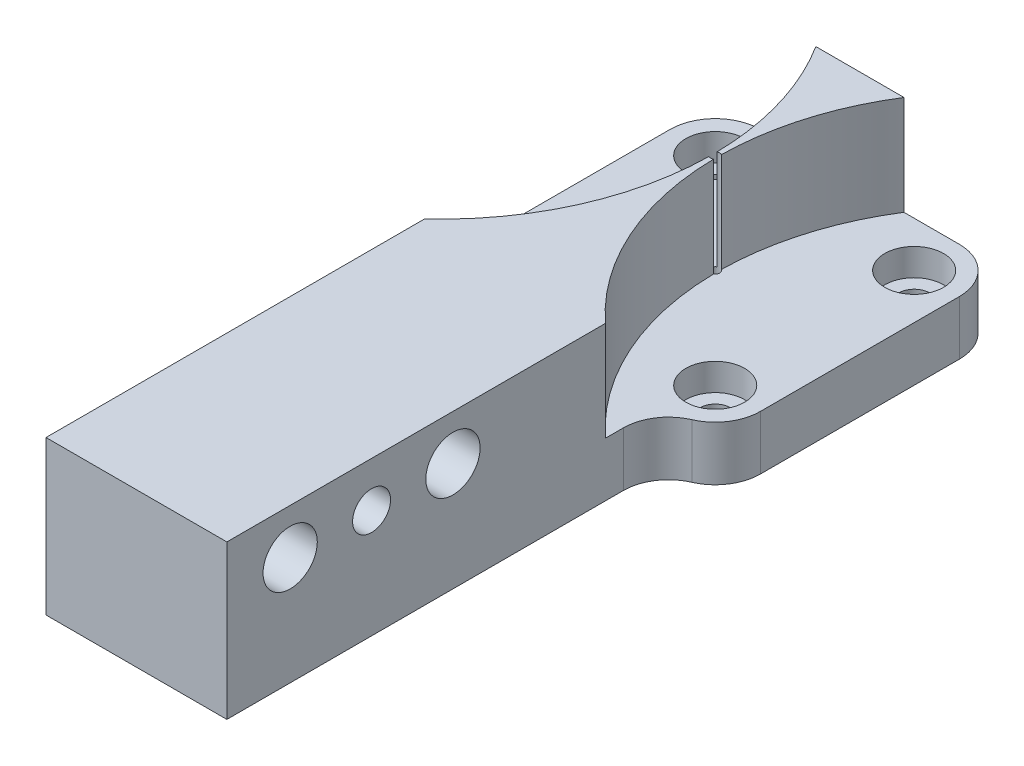
ISO-10303-21;
HEADER;
FILE_DESCRIPTION(('STEP AP214'),'2;1');
FILE_NAME('part.step','',(''),(''),'','','');
FILE_SCHEMA(('AUTOMOTIVE_DESIGN { 1 0 10303 214 1 1 1 1 }'));
ENDSEC;
DATA;
#1=APPLICATION_CONTEXT('core data for automotive mechanical design processes');
#2=APPLICATION_PROTOCOL_DEFINITION('international standard','automotive_design',2000,#1);
#3=PRODUCT_CONTEXT('',#1,'mechanical');
#4=PRODUCT('Part','Part','',(#3));
#5=PRODUCT_RELATED_PRODUCT_CATEGORY('part','',(#4));
#6=PRODUCT_DEFINITION_FORMATION('','',#4);
#7=PRODUCT_DEFINITION_CONTEXT('part definition',#1,'design');
#8=PRODUCT_DEFINITION('design','',#6,#7);
#9=PRODUCT_DEFINITION_SHAPE('','',#8);
#10=(LENGTH_UNIT() NAMED_UNIT(*) SI_UNIT(.MILLI.,.METRE.));
#11=(NAMED_UNIT(*) PLANE_ANGLE_UNIT() SI_UNIT($,.RADIAN.));
#12=(NAMED_UNIT(*) SI_UNIT($,.STERADIAN.) SOLID_ANGLE_UNIT());
#13=UNCERTAINTY_MEASURE_WITH_UNIT(LENGTH_MEASURE(1.E-05),#10,'distance_accuracy_value','');
#14=(GEOMETRIC_REPRESENTATION_CONTEXT(3) GLOBAL_UNCERTAINTY_ASSIGNED_CONTEXT((#13)) GLOBAL_UNIT_ASSIGNED_CONTEXT((#10,
#11,#12)) REPRESENTATION_CONTEXT('',''));
#15=CARTESIAN_POINT('',(0.,0.,0.));
#16=DIRECTION('',(0.,0.,1.));
#17=DIRECTION('',(1.,0.,0.));
#18=AXIS2_PLACEMENT_3D('',#15,#16,#17);
#19=CARTESIAN_POINT('',(30.25,11.,16.25));
#20=DIRECTION('',(0.,-1.,0.));
#21=DIRECTION('',(0.,0.,-1.));
#22=AXIS2_PLACEMENT_3D('',#19,#20,#21);
#23=CYLINDRICAL_SURFACE('',#22,30.);
#24=DIRECTION('',(0.,-1.,0.));
#25=VECTOR('',#24,1.);
#26=CARTESIAN_POINT('',(4.87284491910096,11.,0.25));
#27=LINE('',#26,#25);
#28=CARTESIAN_POINT('',(4.87284491910096,11.,0.249999999999999));
#29=VERTEX_POINT('',#28);
#30=CARTESIAN_POINT('',(4.87284491910096,0.,0.25));
#31=VERTEX_POINT('',#30);
#32=EDGE_CURVE('E290',#29,#31,#27,.T.);
#33=ORIENTED_EDGE('',*,*,#32,.F.);
#34=CARTESIAN_POINT('',(30.25,11.,16.25));
#35=DIRECTION('',(0.,-1.,0.));
#36=DIRECTION('',(0.,0.,1.));
#37=AXIS2_PLACEMENT_3D('',#34,#35,#36);
#38=CIRCLE('',#37,30.);
#39=CARTESIAN_POINT('',(0.253099173553696,11.,15.8187914560837));
#40=VERTEX_POINT('',#39);
#41=EDGE_CURVE('E415',#40,#29,#38,.T.);
#42=ORIENTED_EDGE('',*,*,#41,.F.);
#43=DIRECTION('',(0.,1.,0.));
#44=VECTOR('',#43,1.);
#45=CARTESIAN_POINT('',(0.253099173553695,2.5,15.8187914560837));
#46=LINE('',#45,#44);
#47=CARTESIAN_POINT('',(0.25309917355372,0.,15.8187914560836));
#48=VERTEX_POINT('',#47);
#49=EDGE_CURVE('E342',#40,#48,#46,.F.);
#50=ORIENTED_EDGE('',*,*,#49,.T.);
#51=CARTESIAN_POINT('',(30.25,0.,16.25));
#52=DIRECTION('',(0.,-1.,0.));
#53=DIRECTION('',(0.,0.,1.));
#54=AXIS2_PLACEMENT_3D('',#51,#52,#53);
#55=CIRCLE('',#54,30.);
#56=EDGE_CURVE('E410',#48,#31,#55,.T.);
#57=ORIENTED_EDGE('',*,*,#56,.T.);
#58=EDGE_LOOP('',(#33,#42,#50,#57));
#59=FACE_BOUND('',#58,.T.);
#60=ADVANCED_FACE('F55',(#59),#23,.F.);
#61=CARTESIAN_POINT('',(-30.25,11.,16.25));
#62=DIRECTION('',(0.,-1.,0.));
#63=DIRECTION('',(0.,0.,-1.));
#64=AXIS2_PLACEMENT_3D('',#61,#62,#63);
#65=CYLINDRICAL_SURFACE('',#64,30.);
#66=DIRECTION('',(0.,-1.,0.));
#67=VECTOR('',#66,1.);
#68=CARTESIAN_POINT('',(-10.,11.,38.3845318450606));
#69=LINE('',#68,#67);
#70=CARTESIAN_POINT('',(-10.,11.,38.3845318450606));
#71=VERTEX_POINT('',#70);
#72=CARTESIAN_POINT('',(-10.,0.,38.3845318450606));
#73=VERTEX_POINT('',#72);
#74=EDGE_CURVE('E279',#71,#73,#69,.T.);
#75=ORIENTED_EDGE('',*,*,#74,.F.);
#76=CARTESIAN_POINT('',(-30.25,11.,16.25));
#77=DIRECTION('',(0.,-1.,0.));
#78=DIRECTION('',(0.,0.,1.));
#79=AXIS2_PLACEMENT_3D('',#76,#77,#78);
#80=CIRCLE('',#79,30.);
#81=CARTESIAN_POINT('',(-0.25309917355372,11.,16.6812085439164));
#82=VERTEX_POINT('',#81);
#83=EDGE_CURVE('E414',#82,#71,#80,.T.);
#84=ORIENTED_EDGE('',*,*,#83,.F.);
#85=DIRECTION('',(0.,1.,0.));
#86=VECTOR('',#85,1.);
#87=CARTESIAN_POINT('',(-0.253099173553695,2.5,16.6812085439163));
#88=LINE('',#87,#86);
#89=CARTESIAN_POINT('',(-0.25309917355372,0.,16.6812085439164));
#90=VERTEX_POINT('',#89);
#91=EDGE_CURVE('E64',#82,#90,#88,.F.);
#92=ORIENTED_EDGE('',*,*,#91,.T.);
#93=CARTESIAN_POINT('',(-30.25,0.,16.25));
#94=DIRECTION('',(0.,-1.,0.));
#95=DIRECTION('',(0.,0.,1.));
#96=AXIS2_PLACEMENT_3D('',#93,#94,#95);
#97=CIRCLE('',#96,30.);
#98=EDGE_CURVE('E419',#90,#73,#97,.T.);
#99=ORIENTED_EDGE('',*,*,#98,.T.);
#100=EDGE_LOOP('',(#75,#84,#92,#99));
#101=FACE_BOUND('',#100,.T.);
#102=ADVANCED_FACE('F498',(#101),#65,.F.);
#103=CARTESIAN_POINT('',(30.25,11.,16.25));
#104=DIRECTION('',(0.,1.,0.));
#105=DIRECTION('',(0.,0.,1.));
#106=AXIS2_PLACEMENT_3D('',#103,#104,#105);
#107=PLANE('',#106);
#108=ORIENTED_EDGE('',*,*,#41,.T.);
#109=DIRECTION('',(-1.,0.,0.));
#110=VECTOR('',#109,1.);
#111=CARTESIAN_POINT('',(-11.,11.,0.249999999999999));
#112=LINE('',#111,#110);
#113=CARTESIAN_POINT('',(-4.87284491910096,11.,0.249999999999999));
#114=VERTEX_POINT('',#113);
#115=EDGE_CURVE('E515',#29,#114,#112,.T.);
#116=ORIENTED_EDGE('',*,*,#115,.T.);
#117=CARTESIAN_POINT('',(-0.253099173553696,11.,15.8187914560837));
#118=VERTEX_POINT('',#117);
#119=EDGE_CURVE('E228',#114,#118,#80,.T.);
#120=ORIENTED_EDGE('',*,*,#119,.T.);
#121=CARTESIAN_POINT('',(0.,11.,16.25));
#122=DIRECTION('',(0.,1.,0.));
#123=DIRECTION('',(0.,0.,1.));
#124=AXIS2_PLACEMENT_3D('',#121,#122,#123);
#125=CIRCLE('',#124,0.499999999999998);
#126=EDGE_CURVE('E226',#40,#118,#125,.T.);
#127=ORIENTED_EDGE('',*,*,#126,.F.);
#128=EDGE_LOOP('',(#108,#116,#120,#127));
#129=FACE_BOUND('',#128,.T.);
#130=ADVANCED_FACE('F513',(#129),#107,.T.);
#131=CARTESIAN_POINT('',(0.,0.,0.));
#132=DIRECTION('',(0.,1.,0.));
#133=DIRECTION('',(0.,0.,1.));
#134=AXIS2_PLACEMENT_3D('',#131,#132,#133);
#135=PLANE('',#134);
#136=CARTESIAN_POINT('',(11.,0.,5.25));
#137=DIRECTION('',(0.,1.,0.));
#138=DIRECTION('',(0.,0.,1.));
#139=AXIS2_PLACEMENT_3D('',#136,#137,#138);
#140=CIRCLE('',#139,3.25);
#141=CARTESIAN_POINT('',(11.,0.,8.5));
#142=VERTEX_POINT('',#141);
#143=EDGE_CURVE('E362',#142,#142,#140,.T.);
#144=ORIENTED_EDGE('',*,*,#143,.F.);
#145=EDGE_LOOP('',(#144));
#146=FACE_BOUND('',#145,.T.);
#147=CARTESIAN_POINT('',(11.,0.,27.25));
#148=DIRECTION('',(0.,1.,0.));
#149=DIRECTION('',(0.,0.,1.));
#150=AXIS2_PLACEMENT_3D('',#147,#148,#149);
#151=CIRCLE('',#150,3.25);
#152=CARTESIAN_POINT('',(11.,0.,30.5));
#153=VERTEX_POINT('',#152);
#154=EDGE_CURVE('E378',#153,#153,#151,.T.);
#155=ORIENTED_EDGE('',*,*,#154,.F.);
#156=EDGE_LOOP('',(#155));
#157=FACE_BOUND('',#156,.T.);
#158=CARTESIAN_POINT('',(11.,0.,5.25));
#159=DIRECTION('',(0.,1.,0.));
#160=DIRECTION('',(0.,0.,1.));
#161=AXIS2_PLACEMENT_3D('',#158,#159,#160);
#162=CIRCLE('',#161,5.);
#163=CARTESIAN_POINT('',(16.,0.,5.25));
#164=VERTEX_POINT('',#163);
#165=CARTESIAN_POINT('',(11.,0.,0.249999999999999));
#166=VERTEX_POINT('',#165);
#167=EDGE_CURVE('E304',#164,#166,#162,.T.);
#168=ORIENTED_EDGE('',*,*,#167,.T.);
#169=DIRECTION('',(-1.,0.,0.));
#170=VECTOR('',#169,1.);
#171=CARTESIAN_POINT('',(0.,0.,0.249999999999999));
#172=LINE('',#171,#170);
#173=EDGE_CURVE('E286',#166,#31,#172,.T.);
#174=ORIENTED_EDGE('',*,*,#173,.T.);
#175=ORIENTED_EDGE('',*,*,#56,.F.);
#176=CARTESIAN_POINT('',(0.,0.,16.25));
#177=DIRECTION('',(0.,1.,0.));
#178=DIRECTION('',(0.,0.,1.));
#179=AXIS2_PLACEMENT_3D('',#176,#177,#178);
#180=CIRCLE('',#179,0.499999999999997);
#181=CARTESIAN_POINT('',(0.25309917355372,0.,16.6812085439163));
#182=VERTEX_POINT('',#181);
#183=EDGE_CURVE('E339',#182,#48,#180,.T.);
#184=ORIENTED_EDGE('',*,*,#183,.F.);
#185=CARTESIAN_POINT('',(9.99999999999999,0.,38.3845318450606));
#186=VERTEX_POINT('',#185);
#187=EDGE_CURVE('E417',#186,#182,#55,.T.);
#188=ORIENTED_EDGE('',*,*,#187,.F.);
#189=DIRECTION('',(0.,0.,-1.));
#190=VECTOR('',#189,1.);
#191=CARTESIAN_POINT('',(9.99999999999999,0.,0.));
#192=LINE('',#191,#190);
#193=CARTESIAN_POINT('',(9.99999999999999,0.,36.4151513899117));
#194=VERTEX_POINT('',#193);
#195=EDGE_CURVE('E254',#186,#194,#192,.T.);
#196=ORIENTED_EDGE('',*,*,#195,.T.);
#197=CARTESIAN_POINT('',(15.,0.,36.4151513899117));
#198=DIRECTION('',(0.,1.,0.));
#199=DIRECTION('',(0.,0.,1.));
#200=AXIS2_PLACEMENT_3D('',#197,#198,#199);
#201=CIRCLE('',#200,5.);
#202=CARTESIAN_POINT('',(13.,0.,31.8325756949558));
#203=VERTEX_POINT('',#202);
#204=EDGE_CURVE('E293',#194,#203,#201,.F.);
#205=ORIENTED_EDGE('',*,*,#204,.T.);
#206=CARTESIAN_POINT('',(11.,0.,27.25));
#207=DIRECTION('',(0.,1.,0.));
#208=DIRECTION('',(0.,0.,1.));
#209=AXIS2_PLACEMENT_3D('',#206,#207,#208);
#210=CIRCLE('',#209,5.);
#211=CARTESIAN_POINT('',(16.,0.,27.25));
#212=VERTEX_POINT('',#211);
#213=EDGE_CURVE('E296',#203,#212,#210,.T.);
#214=ORIENTED_EDGE('',*,*,#213,.T.);
#215=DIRECTION('',(0.,0.,-1.));
#216=VECTOR('',#215,1.);
#217=CARTESIAN_POINT('',(16.,0.,0.));
#218=LINE('',#217,#216);
#219=EDGE_CURVE('E300',#212,#164,#218,.T.);
#220=ORIENTED_EDGE('',*,*,#219,.T.);
#221=EDGE_LOOP('',(#168,#174,#175,#184,#188,#196,#205,#214,#220));
#222=FACE_BOUND('',#221,.T.);
#223=ADVANCED_FACE('F432',(#146,#157,#222),#135,.T.);
#224=CARTESIAN_POINT('',(-11.,0.,5.25));
#225=DIRECTION('',(0.,1.,0.));
#226=DIRECTION('',(0.,0.,1.));
#227=AXIS2_PLACEMENT_3D('',#224,#225,#226);
#228=CIRCLE('',#227,3.25);
#229=CARTESIAN_POINT('',(-11.,0.,8.5));
#230=VERTEX_POINT('',#229);
#231=EDGE_CURVE('E346',#230,#230,#228,.T.);
#232=ORIENTED_EDGE('',*,*,#231,.F.);
#233=EDGE_LOOP('',(#232));
#234=FACE_BOUND('',#233,.T.);
#235=CARTESIAN_POINT('',(-11.,0.,27.25));
#236=DIRECTION('',(0.,1.,0.));
#237=DIRECTION('',(0.,0.,1.));
#238=AXIS2_PLACEMENT_3D('',#235,#236,#237);
#239=CIRCLE('',#238,3.25);
#240=CARTESIAN_POINT('',(-11.,0.,30.5));
#241=VERTEX_POINT('',#240);
#242=EDGE_CURVE('E394',#241,#241,#239,.T.);
#243=ORIENTED_EDGE('',*,*,#242,.F.);
#244=EDGE_LOOP('',(#243));
#245=FACE_BOUND('',#244,.T.);
#246=CARTESIAN_POINT('',(-15.,0.,36.4151513899117));
#247=DIRECTION('',(0.,1.,0.));
#248=DIRECTION('',(0.,0.,1.));
#249=AXIS2_PLACEMENT_3D('',#246,#247,#248);
#250=CIRCLE('',#249,5.);
#251=CARTESIAN_POINT('',(-13.,0.,31.8325756949558));
#252=VERTEX_POINT('',#251);
#253=CARTESIAN_POINT('',(-10.,0.,36.4151513899117));
#254=VERTEX_POINT('',#253);
#255=EDGE_CURVE('E320',#252,#254,#250,.F.);
#256=ORIENTED_EDGE('',*,*,#255,.T.);
#257=DIRECTION('',(0.,0.,1.));
#258=VECTOR('',#257,1.);
#259=CARTESIAN_POINT('',(-10.,0.,0.));
#260=LINE('',#259,#258);
#261=EDGE_CURVE('E275',#254,#73,#260,.T.);
#262=ORIENTED_EDGE('',*,*,#261,.T.);
#263=ORIENTED_EDGE('',*,*,#98,.F.);
#264=CARTESIAN_POINT('',(0.,0.,16.25));
#265=DIRECTION('',(0.,1.,0.));
#266=DIRECTION('',(0.,0.,1.));
#267=AXIS2_PLACEMENT_3D('',#264,#265,#266);
#268=CIRCLE('',#267,0.499999999999997);
#269=CARTESIAN_POINT('',(-0.25309917355372,0.,15.8187914560837));
#270=VERTEX_POINT('',#269);
#271=EDGE_CURVE('E244',#270,#90,#268,.T.);
#272=ORIENTED_EDGE('',*,*,#271,.F.);
#273=CARTESIAN_POINT('',(-4.87284491910096,0.,0.25));
#274=VERTEX_POINT('',#273);
#275=EDGE_CURVE('E232',#274,#270,#97,.T.);
#276=ORIENTED_EDGE('',*,*,#275,.F.);
#277=DIRECTION('',(-1.,0.,0.));
#278=VECTOR('',#277,1.);
#279=CARTESIAN_POINT('',(0.,0.,0.249999999999999));
#280=LINE('',#279,#278);
#281=CARTESIAN_POINT('',(-11.,0.,0.249999999999999));
#282=VERTEX_POINT('',#281);
#283=EDGE_CURVE('E282',#274,#282,#280,.T.);
#284=ORIENTED_EDGE('',*,*,#283,.T.);
#285=CARTESIAN_POINT('',(-11.,0.,5.25));
#286=DIRECTION('',(0.,1.,0.));
#287=DIRECTION('',(0.,0.,1.));
#288=AXIS2_PLACEMENT_3D('',#285,#286,#287);
#289=CIRCLE('',#288,5.);
#290=CARTESIAN_POINT('',(-16.,0.,5.25));
#291=VERTEX_POINT('',#290);
#292=EDGE_CURVE('E308',#282,#291,#289,.T.);
#293=ORIENTED_EDGE('',*,*,#292,.T.);
#294=DIRECTION('',(0.,0.,1.));
#295=VECTOR('',#294,1.);
#296=CARTESIAN_POINT('',(-16.,0.,0.));
#297=LINE('',#296,#295);
#298=CARTESIAN_POINT('',(-16.,0.,27.25));
#299=VERTEX_POINT('',#298);
#300=EDGE_CURVE('E312',#291,#299,#297,.T.);
#301=ORIENTED_EDGE('',*,*,#300,.T.);
#302=CARTESIAN_POINT('',(-11.,0.,27.25));
#303=DIRECTION('',(0.,1.,0.));
#304=DIRECTION('',(0.,0.,1.));
#305=AXIS2_PLACEMENT_3D('',#302,#303,#304);
#306=CIRCLE('',#305,5.);
#307=EDGE_CURVE('E316',#299,#252,#306,.T.);
#308=ORIENTED_EDGE('',*,*,#307,.T.);
#309=EDGE_LOOP('',(#256,#262,#263,#272,#276,#284,#293,#301,#308));
#310=FACE_BOUND('',#309,.T.);
#311=ADVANCED_FACE('F496',(#234,#245,#310),#135,.T.);
#312=CARTESIAN_POINT('',(-16.25,-6.,80.25));
#313=DIRECTION('',(0.,0.,1.));
#314=DIRECTION('',(1.,0.,0.));
#315=AXIS2_PLACEMENT_3D('',#312,#313,#314);
#316=PLANE('',#315);
#317=DIRECTION('',(1.,0.,0.));
#318=VECTOR('',#317,1.);
#319=CARTESIAN_POINT('',(-16.25,11.,80.25));
#320=LINE('',#319,#318);
#321=CARTESIAN_POINT('',(-10.,11.,80.25));
#322=VERTEX_POINT('',#321);
#323=CARTESIAN_POINT('',(9.99999999999999,11.,80.25));
#324=VERTEX_POINT('',#323);
#325=EDGE_CURVE('E222',#322,#324,#320,.T.);
#326=ORIENTED_EDGE('',*,*,#325,.F.);
#327=DIRECTION('',(0.,1.,0.));
#328=VECTOR('',#327,1.);
#329=CARTESIAN_POINT('',(-10.,-6.,80.25));
#330=LINE('',#329,#328);
#331=CARTESIAN_POINT('',(-10.,-6.,80.25));
#332=VERTEX_POINT('',#331);
#333=EDGE_CURVE('E219',#332,#322,#330,.T.);
#334=ORIENTED_EDGE('',*,*,#333,.F.);
#335=DIRECTION('',(1.,0.,0.));
#336=VECTOR('',#335,1.);
#337=CARTESIAN_POINT('',(-16.25,-6.,80.25));
#338=LINE('',#337,#336);
#339=CARTESIAN_POINT('',(9.99999999999999,-6.,80.25));
#340=VERTEX_POINT('',#339);
#341=EDGE_CURVE('E211',#332,#340,#338,.T.);
#342=ORIENTED_EDGE('',*,*,#341,.T.);
#343=DIRECTION('',(0.,1.,0.));
#344=VECTOR('',#343,1.);
#345=CARTESIAN_POINT('',(9.99999999999999,-6.,80.25));
#346=LINE('',#345,#344);
#347=EDGE_CURVE('E191',#340,#324,#346,.T.);
#348=ORIENTED_EDGE('',*,*,#347,.T.);
#349=EDGE_LOOP('',(#326,#334,#342,#348));
#350=FACE_BOUND('',#349,.T.);
#351=ADVANCED_FACE('F57',(#350),#316,.T.);
#352=CARTESIAN_POINT('',(0.,-6.,0.));
#353=DIRECTION('',(0.,1.,0.));
#354=DIRECTION('',(0.,0.,1.));
#355=AXIS2_PLACEMENT_3D('',#352,#353,#354);
#356=PLANE('',#355);
#357=CARTESIAN_POINT('',(-11.,-6.,27.25));
#358=DIRECTION('',(0.,1.,0.));
#359=DIRECTION('',(0.,0.,1.));
#360=AXIS2_PLACEMENT_3D('',#357,#358,#359);
#361=CIRCLE('',#360,1.7);
#362=CARTESIAN_POINT('',(-11.,-6.,28.95));
#363=VERTEX_POINT('',#362);
#364=EDGE_CURVE('E406',#363,#363,#361,.T.);
#365=ORIENTED_EDGE('',*,*,#364,.T.);
#366=EDGE_LOOP('',(#365));
#367=FACE_BOUND('',#366,.T.);
#368=CARTESIAN_POINT('',(11.,-6.,27.25));
#369=DIRECTION('',(0.,1.,0.));
#370=DIRECTION('',(0.,0.,1.));
#371=AXIS2_PLACEMENT_3D('',#368,#369,#370);
#372=CIRCLE('',#371,1.7);
#373=CARTESIAN_POINT('',(11.,-6.,28.95));
#374=VERTEX_POINT('',#373);
#375=EDGE_CURVE('E390',#374,#374,#372,.T.);
#376=ORIENTED_EDGE('',*,*,#375,.T.);
#377=EDGE_LOOP('',(#376));
#378=FACE_BOUND('',#377,.T.);
#379=CARTESIAN_POINT('',(11.,-6.,5.25));
#380=DIRECTION('',(0.,1.,0.));
#381=DIRECTION('',(0.,0.,1.));
#382=AXIS2_PLACEMENT_3D('',#379,#380,#381);
#383=CIRCLE('',#382,1.7);
#384=CARTESIAN_POINT('',(11.,-6.,6.94999999999999));
#385=VERTEX_POINT('',#384);
#386=EDGE_CURVE('E374',#385,#385,#383,.T.);
#387=ORIENTED_EDGE('',*,*,#386,.T.);
#388=EDGE_LOOP('',(#387));
#389=FACE_BOUND('',#388,.T.);
#390=CARTESIAN_POINT('',(-11.,-6.,5.25));
#391=DIRECTION('',(0.,1.,0.));
#392=DIRECTION('',(0.,0.,1.));
#393=AXIS2_PLACEMENT_3D('',#390,#391,#392);
#394=CIRCLE('',#393,1.7);
#395=CARTESIAN_POINT('',(-11.,-6.,6.95));
#396=VERTEX_POINT('',#395);
#397=EDGE_CURVE('E358',#396,#396,#394,.T.);
#398=ORIENTED_EDGE('',*,*,#397,.T.);
#399=EDGE_LOOP('',(#398));
#400=FACE_BOUND('',#399,.T.);
#401=CARTESIAN_POINT('',(0.,-6.,16.25));
#402=DIRECTION('',(0.,-1.,0.));
#403=DIRECTION('',(0.,0.,-1.));
#404=AXIS2_PLACEMENT_3D('',#401,#402,#403);
#405=CIRCLE('',#404,1.5);
#406=CARTESIAN_POINT('',(0.,-6.,14.75));
#407=VERTEX_POINT('',#406);
#408=EDGE_CURVE('E324',#407,#407,#405,.T.);
#409=ORIENTED_EDGE('',*,*,#408,.F.);
#410=EDGE_LOOP('',(#409));
#411=FACE_BOUND('',#410,.T.);
#412=DIRECTION('',(0.,0.,1.));
#413=VECTOR('',#412,1.);
#414=CARTESIAN_POINT('',(-10.,-6.,80.25));
#415=LINE('',#414,#413);
#416=CARTESIAN_POINT('',(-10.,-6.,36.4151513899117));
#417=VERTEX_POINT('',#416);
#418=EDGE_CURVE('E205',#417,#332,#415,.T.);
#419=ORIENTED_EDGE('',*,*,#418,.F.);
#420=CARTESIAN_POINT('',(-15.,-6.,36.4151513899117));
#421=DIRECTION('',(0.,-1.,0.));
#422=DIRECTION('',(0.,0.,1.));
#423=AXIS2_PLACEMENT_3D('',#420,#421,#422);
#424=CIRCLE('',#423,5.);
#425=CARTESIAN_POINT('',(-13.,-6.,31.8325756949558));
#426=VERTEX_POINT('',#425);
#427=EDGE_CURVE('E561',#426,#417,#424,.T.);
#428=ORIENTED_EDGE('',*,*,#427,.F.);
#429=CARTESIAN_POINT('',(-11.,-6.,27.25));
#430=DIRECTION('',(0.,1.,0.));
#431=DIRECTION('',(0.,0.,1.));
#432=AXIS2_PLACEMENT_3D('',#429,#430,#431);
#433=CIRCLE('',#432,5.);
#434=CARTESIAN_POINT('',(-16.,-6.,27.25));
#435=VERTEX_POINT('',#434);
#436=EDGE_CURVE('E554',#435,#426,#433,.T.);
#437=ORIENTED_EDGE('',*,*,#436,.F.);
#438=DIRECTION('',(0.,0.,1.));
#439=VECTOR('',#438,1.);
#440=CARTESIAN_POINT('',(-16.,-6.,5.25));
#441=LINE('',#440,#439);
#442=CARTESIAN_POINT('',(-16.,-6.,5.25));
#443=VERTEX_POINT('',#442);
#444=EDGE_CURVE('E550',#443,#435,#441,.T.);
#445=ORIENTED_EDGE('',*,*,#444,.F.);
#446=CARTESIAN_POINT('',(-11.,-6.,5.25));
#447=DIRECTION('',(0.,1.,0.));
#448=DIRECTION('',(0.,0.,1.));
#449=AXIS2_PLACEMENT_3D('',#446,#447,#448);
#450=CIRCLE('',#449,5.);
#451=CARTESIAN_POINT('',(-11.,-6.,0.249999999999999));
#452=VERTEX_POINT('',#451);
#453=EDGE_CURVE('E542',#452,#443,#450,.T.);
#454=ORIENTED_EDGE('',*,*,#453,.F.);
#455=DIRECTION('',(-1.,0.,0.));
#456=VECTOR('',#455,1.);
#457=CARTESIAN_POINT('',(-11.,-6.,0.249999999999999));
#458=LINE('',#457,#456);
#459=CARTESIAN_POINT('',(11.,-6.,0.249999999999999));
#460=VERTEX_POINT('',#459);
#461=EDGE_CURVE('E546',#460,#452,#458,.T.);
#462=ORIENTED_EDGE('',*,*,#461,.F.);
#463=CARTESIAN_POINT('',(11.,-6.,5.25));
#464=DIRECTION('',(0.,1.,0.));
#465=DIRECTION('',(0.,0.,1.));
#466=AXIS2_PLACEMENT_3D('',#463,#464,#465);
#467=CIRCLE('',#466,5.);
#468=CARTESIAN_POINT('',(16.,-6.,5.25));
#469=VERTEX_POINT('',#468);
#470=EDGE_CURVE('E443',#469,#460,#467,.T.);
#471=ORIENTED_EDGE('',*,*,#470,.F.);
#472=DIRECTION('',(0.,0.,-1.));
#473=VECTOR('',#472,1.);
#474=CARTESIAN_POINT('',(16.,-6.,5.25));
#475=LINE('',#474,#473);
#476=CARTESIAN_POINT('',(16.,-6.,27.25));
#477=VERTEX_POINT('',#476);
#478=EDGE_CURVE('E883',#477,#469,#475,.T.);
#479=ORIENTED_EDGE('',*,*,#478,.F.);
#480=CARTESIAN_POINT('',(11.,-6.,27.25));
#481=DIRECTION('',(0.,1.,0.));
#482=DIRECTION('',(0.,0.,1.));
#483=AXIS2_PLACEMENT_3D('',#480,#481,#482);
#484=CIRCLE('',#483,5.);
#485=CARTESIAN_POINT('',(13.,-6.,31.8325756949558));
#486=VERTEX_POINT('',#485);
#487=EDGE_CURVE('E878',#486,#477,#484,.T.);
#488=ORIENTED_EDGE('',*,*,#487,.F.);
#489=CARTESIAN_POINT('',(15.,-6.,36.4151513899117));
#490=DIRECTION('',(0.,-1.,0.));
#491=DIRECTION('',(0.,0.,1.));
#492=AXIS2_PLACEMENT_3D('',#489,#490,#491);
#493=CIRCLE('',#492,5.);
#494=CARTESIAN_POINT('',(9.99999999999999,-6.,36.4151513899117));
#495=VERTEX_POINT('',#494);
#496=EDGE_CURVE('E214',#495,#486,#493,.T.);
#497=ORIENTED_EDGE('',*,*,#496,.F.);
#498=DIRECTION('',(0.,0.,-1.));
#499=VECTOR('',#498,1.);
#500=CARTESIAN_POINT('',(9.99999999999999,-6.,80.25));
#501=LINE('',#500,#499);
#502=EDGE_CURVE('E196',#340,#495,#501,.T.);
#503=ORIENTED_EDGE('',*,*,#502,.F.);
#504=ORIENTED_EDGE('',*,*,#341,.F.);
#505=EDGE_LOOP('',(#419,#428,#437,#445,#454,#462,#471,#479,#488,#497,#503,#504));
#506=FACE_BOUND('',#505,.T.);
#507=ADVANCED_FACE('F210',(#367,#378,#389,#400,#411,#506),#356,.F.);
#508=DIRECTION('',(0.,-1.,0.));
#509=VECTOR('',#508,1.);
#510=CARTESIAN_POINT('',(9.99999999999999,11.,38.3845318450606));
#511=LINE('',#510,#509);
#512=CARTESIAN_POINT('',(9.99999999999999,11.,38.3845318450606));
#513=VERTEX_POINT('',#512);
#514=EDGE_CURVE('E71',#186,#513,#511,.F.);
#515=ORIENTED_EDGE('',*,*,#514,.F.);
#516=ORIENTED_EDGE('',*,*,#187,.T.);
#517=DIRECTION('',(0.,1.,0.));
#518=VECTOR('',#517,1.);
#519=CARTESIAN_POINT('',(0.253099173553695,2.5,16.6812085439163));
#520=LINE('',#519,#518);
#521=CARTESIAN_POINT('',(0.253099173553696,11.,16.6812085439163));
#522=VERTEX_POINT('',#521);
#523=EDGE_CURVE('E335',#182,#522,#520,.T.);
#524=ORIENTED_EDGE('',*,*,#523,.T.);
#525=EDGE_CURVE('E411',#513,#522,#38,.T.);
#526=ORIENTED_EDGE('',*,*,#525,.F.);
#527=EDGE_LOOP('',(#515,#516,#524,#526));
#528=FACE_BOUND('',#527,.T.);
#529=ADVANCED_FACE('F581',(#528),#23,.F.);
#530=DIRECTION('',(0.,-1.,0.));
#531=VECTOR('',#530,1.);
#532=CARTESIAN_POINT('',(-4.87284491910096,11.,0.25));
#533=LINE('',#532,#531);
#534=EDGE_CURVE('E11',#274,#114,#533,.F.);
#535=ORIENTED_EDGE('',*,*,#534,.F.);
#536=ORIENTED_EDGE('',*,*,#275,.T.);
#537=DIRECTION('',(0.,1.,0.));
#538=VECTOR('',#537,1.);
#539=CARTESIAN_POINT('',(-0.253099173553695,2.5,15.8187914560837));
#540=LINE('',#539,#538);
#541=EDGE_CURVE('E234',#270,#118,#540,.T.);
#542=ORIENTED_EDGE('',*,*,#541,.T.);
#543=ORIENTED_EDGE('',*,*,#119,.F.);
#544=EDGE_LOOP('',(#535,#536,#542,#543));
#545=FACE_BOUND('',#544,.T.);
#546=ADVANCED_FACE('F507',(#545),#65,.F.);
#547=ORIENTED_EDGE('',*,*,#83,.T.);
#548=DIRECTION('',(0.,0.,1.));
#549=VECTOR('',#548,1.);
#550=CARTESIAN_POINT('',(-10.,11.,80.25));
#551=LINE('',#550,#549);
#552=EDGE_CURVE('E216',#71,#322,#551,.T.);
#553=ORIENTED_EDGE('',*,*,#552,.T.);
#554=ORIENTED_EDGE('',*,*,#325,.T.);
#555=DIRECTION('',(0.,0.,-1.));
#556=VECTOR('',#555,1.);
#557=CARTESIAN_POINT('',(9.99999999999999,11.,80.25));
#558=LINE('',#557,#556);
#559=EDGE_CURVE('E198',#324,#513,#558,.T.);
#560=ORIENTED_EDGE('',*,*,#559,.T.);
#561=ORIENTED_EDGE('',*,*,#525,.T.);
#562=EDGE_CURVE('E221',#82,#522,#125,.T.);
#563=ORIENTED_EDGE('',*,*,#562,.F.);
#564=EDGE_LOOP('',(#547,#553,#554,#560,#561,#563));
#565=FACE_BOUND('',#564,.T.);
#566=ADVANCED_FACE('F593',(#565),#107,.T.);
#567=CARTESIAN_POINT('',(0.,11.,16.25));
#568=DIRECTION('',(0.,1.,0.));
#569=DIRECTION('',(0.,0.,1.));
#570=AXIS2_PLACEMENT_3D('',#567,#568,#569);
#571=CYLINDRICAL_SURFACE('',#570,0.499999999999997);
#572=ORIENTED_EDGE('',*,*,#126,.T.);
#573=ORIENTED_EDGE('',*,*,#541,.F.);
#574=ORIENTED_EDGE('',*,*,#271,.T.);
#575=ORIENTED_EDGE('',*,*,#91,.F.);
#576=ORIENTED_EDGE('',*,*,#562,.T.);
#577=ORIENTED_EDGE('',*,*,#523,.F.);
#578=ORIENTED_EDGE('',*,*,#183,.T.);
#579=ORIENTED_EDGE('',*,*,#49,.F.);
#580=EDGE_LOOP('',(#572,#573,#574,#575,#576,#577,#578,#579));
#581=FACE_BOUND('',#580,.T.);
#582=CARTESIAN_POINT('',(0.,-1.,16.25));
#583=DIRECTION('',(0.,-1.,0.));
#584=DIRECTION('',(0.,0.,-1.));
#585=AXIS2_PLACEMENT_3D('',#582,#583,#584);
#586=CIRCLE('',#585,0.499999999999997);
#587=CARTESIAN_POINT('',(0.,-1.,15.75));
#588=VERTEX_POINT('',#587);
#589=EDGE_CURVE('E240',#588,#588,#586,.F.);
#590=ORIENTED_EDGE('',*,*,#589,.F.);
#591=EDGE_LOOP('',(#590));
#592=FACE_BOUND('',#591,.T.);
#593=ADVANCED_FACE('F509',(#581,#592),#571,.F.);
#594=CARTESIAN_POINT('',(-11.,0.,27.25));
#595=DIRECTION('',(0.,1.,0.));
#596=DIRECTION('',(0.,0.,1.));
#597=AXIS2_PLACEMENT_3D('',#594,#595,#596);
#598=CYLINDRICAL_SURFACE('',#597,1.7);
#599=ORIENTED_EDGE('',*,*,#364,.F.);
#600=EDGE_LOOP('',(#599));
#601=FACE_BOUND('',#600,.T.);
#602=CARTESIAN_POINT('',(-11.,-3.,27.25));
#603=DIRECTION('',(0.,1.,0.));
#604=DIRECTION('',(0.,0.,1.));
#605=AXIS2_PLACEMENT_3D('',#602,#603,#604);
#606=CIRCLE('',#605,1.7);
#607=CARTESIAN_POINT('',(-11.,-3.,28.95));
#608=VERTEX_POINT('',#607);
#609=EDGE_CURVE('E402',#608,#608,#606,.T.);
#610=ORIENTED_EDGE('',*,*,#609,.T.);
#611=EDGE_LOOP('',(#610));
#612=FACE_BOUND('',#611,.T.);
#613=ADVANCED_FACE('F602',(#601,#612),#598,.F.);
#614=CARTESIAN_POINT('',(-9.3,-3.,27.25));
#615=DIRECTION('',(0.,-1.,0.));
#616=DIRECTION('',(0.,0.,-1.));
#617=AXIS2_PLACEMENT_3D('',#614,#615,#616);
#618=PLANE('',#617);
#619=ORIENTED_EDGE('',*,*,#609,.F.);
#620=EDGE_LOOP('',(#619));
#621=FACE_BOUND('',#620,.T.);
#622=CARTESIAN_POINT('',(-11.,-3.,27.25));
#623=DIRECTION('',(0.,1.,0.));
#624=DIRECTION('',(0.,0.,1.));
#625=AXIS2_PLACEMENT_3D('',#622,#623,#624);
#626=CIRCLE('',#625,3.25);
#627=CARTESIAN_POINT('',(-11.,-3.,30.5));
#628=VERTEX_POINT('',#627);
#629=EDGE_CURVE('E398',#628,#628,#626,.T.);
#630=ORIENTED_EDGE('',*,*,#629,.T.);
#631=EDGE_LOOP('',(#630));
#632=FACE_BOUND('',#631,.T.);
#633=ADVANCED_FACE('F643',(#621,#632),#618,.F.);
#634=CARTESIAN_POINT('',(-11.,0.,27.25));
#635=DIRECTION('',(0.,1.,0.));
#636=DIRECTION('',(0.,0.,1.));
#637=AXIS2_PLACEMENT_3D('',#634,#635,#636);
#638=CYLINDRICAL_SURFACE('',#637,3.25);
#639=ORIENTED_EDGE('',*,*,#629,.F.);
#640=EDGE_LOOP('',(#639));
#641=FACE_BOUND('',#640,.T.);
#642=ORIENTED_EDGE('',*,*,#242,.T.);
#643=EDGE_LOOP('',(#642));
#644=FACE_BOUND('',#643,.T.);
#645=ADVANCED_FACE('F639',(#641,#644),#638,.F.);
#646=CARTESIAN_POINT('',(11.,0.,27.25));
#647=DIRECTION('',(0.,1.,0.));
#648=DIRECTION('',(0.,0.,1.));
#649=AXIS2_PLACEMENT_3D('',#646,#647,#648);
#650=CYLINDRICAL_SURFACE('',#649,1.7);
#651=ORIENTED_EDGE('',*,*,#375,.F.);
#652=EDGE_LOOP('',(#651));
#653=FACE_BOUND('',#652,.T.);
#654=CARTESIAN_POINT('',(11.,-3.,27.25));
#655=DIRECTION('',(0.,1.,0.));
#656=DIRECTION('',(0.,0.,1.));
#657=AXIS2_PLACEMENT_3D('',#654,#655,#656);
#658=CIRCLE('',#657,1.7);
#659=CARTESIAN_POINT('',(11.,-3.,28.95));
#660=VERTEX_POINT('',#659);
#661=EDGE_CURVE('E386',#660,#660,#658,.T.);
#662=ORIENTED_EDGE('',*,*,#661,.T.);
#663=EDGE_LOOP('',(#662));
#664=FACE_BOUND('',#663,.T.);
#665=ADVANCED_FACE('F631',(#653,#664),#650,.F.);
#666=CARTESIAN_POINT('',(12.7,-3.,27.25));
#667=DIRECTION('',(0.,-1.,0.));
#668=DIRECTION('',(0.,0.,-1.));
#669=AXIS2_PLACEMENT_3D('',#666,#667,#668);
#670=PLANE('',#669);
#671=ORIENTED_EDGE('',*,*,#661,.F.);
#672=EDGE_LOOP('',(#671));
#673=FACE_BOUND('',#672,.T.);
#674=CARTESIAN_POINT('',(11.,-3.,27.25));
#675=DIRECTION('',(0.,1.,0.));
#676=DIRECTION('',(0.,0.,1.));
#677=AXIS2_PLACEMENT_3D('',#674,#675,#676);
#678=CIRCLE('',#677,3.25);
#679=CARTESIAN_POINT('',(11.,-3.,30.5));
#680=VERTEX_POINT('',#679);
#681=EDGE_CURVE('E382',#680,#680,#678,.T.);
#682=ORIENTED_EDGE('',*,*,#681,.T.);
#683=EDGE_LOOP('',(#682));
#684=FACE_BOUND('',#683,.T.);
#685=ADVANCED_FACE('F621',(#673,#684),#670,.F.);
#686=CARTESIAN_POINT('',(11.,0.,27.25));
#687=DIRECTION('',(0.,1.,0.));
#688=DIRECTION('',(0.,0.,1.));
#689=AXIS2_PLACEMENT_3D('',#686,#687,#688);
#690=CYLINDRICAL_SURFACE('',#689,3.25);
#691=ORIENTED_EDGE('',*,*,#681,.F.);
#692=EDGE_LOOP('',(#691));
#693=FACE_BOUND('',#692,.T.);
#694=ORIENTED_EDGE('',*,*,#154,.T.);
#695=EDGE_LOOP('',(#694));
#696=FACE_BOUND('',#695,.T.);
#697=ADVANCED_FACE('F618',(#693,#696),#690,.F.);
#698=CARTESIAN_POINT('',(11.,0.,5.25));
#699=DIRECTION('',(0.,1.,0.));
#700=DIRECTION('',(0.,0.,1.));
#701=AXIS2_PLACEMENT_3D('',#698,#699,#700);
#702=CYLINDRICAL_SURFACE('',#701,1.7);
#703=ORIENTED_EDGE('',*,*,#386,.F.);
#704=EDGE_LOOP('',(#703));
#705=FACE_BOUND('',#704,.T.);
#706=CARTESIAN_POINT('',(11.,-3.,5.25));
#707=DIRECTION('',(0.,1.,0.));
#708=DIRECTION('',(0.,0.,1.));
#709=AXIS2_PLACEMENT_3D('',#706,#707,#708);
#710=CIRCLE('',#709,1.7);
#711=CARTESIAN_POINT('',(11.,-3.,6.95));
#712=VERTEX_POINT('',#711);
#713=EDGE_CURVE('E370',#712,#712,#710,.T.);
#714=ORIENTED_EDGE('',*,*,#713,.T.);
#715=EDGE_LOOP('',(#714));
#716=FACE_BOUND('',#715,.T.);
#717=ADVANCED_FACE('F620',(#705,#716),#702,.F.);
#718=CARTESIAN_POINT('',(12.7,-3.,5.25));
#719=DIRECTION('',(0.,-1.,0.));
#720=DIRECTION('',(0.,0.,-1.));
#721=AXIS2_PLACEMENT_3D('',#718,#719,#720);
#722=PLANE('',#721);
#723=ORIENTED_EDGE('',*,*,#713,.F.);
#724=EDGE_LOOP('',(#723));
#725=FACE_BOUND('',#724,.T.);
#726=CARTESIAN_POINT('',(11.,-3.,5.25));
#727=DIRECTION('',(0.,1.,0.));
#728=DIRECTION('',(0.,0.,1.));
#729=AXIS2_PLACEMENT_3D('',#726,#727,#728);
#730=CIRCLE('',#729,3.25);
#731=CARTESIAN_POINT('',(11.,-3.,8.5));
#732=VERTEX_POINT('',#731);
#733=EDGE_CURVE('E366',#732,#732,#730,.T.);
#734=ORIENTED_EDGE('',*,*,#733,.T.);
#735=EDGE_LOOP('',(#734));
#736=FACE_BOUND('',#735,.T.);
#737=ADVANCED_FACE('F628',(#725,#736),#722,.F.);
#738=CARTESIAN_POINT('',(11.,0.,5.25));
#739=DIRECTION('',(0.,1.,0.));
#740=DIRECTION('',(0.,0.,1.));
#741=AXIS2_PLACEMENT_3D('',#738,#739,#740);
#742=CYLINDRICAL_SURFACE('',#741,3.25);
#743=ORIENTED_EDGE('',*,*,#733,.F.);
#744=EDGE_LOOP('',(#743));
#745=FACE_BOUND('',#744,.T.);
#746=ORIENTED_EDGE('',*,*,#143,.T.);
#747=EDGE_LOOP('',(#746));
#748=FACE_BOUND('',#747,.T.);
#749=ADVANCED_FACE('F693',(#745,#748),#742,.F.);
#750=CARTESIAN_POINT('',(-11.,0.,5.25));
#751=DIRECTION('',(0.,1.,0.));
#752=DIRECTION('',(0.,0.,1.));
#753=AXIS2_PLACEMENT_3D('',#750,#751,#752);
#754=CYLINDRICAL_SURFACE('',#753,1.7);
#755=ORIENTED_EDGE('',*,*,#397,.F.);
#756=EDGE_LOOP('',(#755));
#757=FACE_BOUND('',#756,.T.);
#758=CARTESIAN_POINT('',(-11.,-3.,5.25));
#759=DIRECTION('',(0.,1.,0.));
#760=DIRECTION('',(0.,0.,1.));
#761=AXIS2_PLACEMENT_3D('',#758,#759,#760);
#762=CIRCLE('',#761,1.7);
#763=CARTESIAN_POINT('',(-11.,-3.,6.95));
#764=VERTEX_POINT('',#763);
#765=EDGE_CURVE('E354',#764,#764,#762,.T.);
#766=ORIENTED_EDGE('',*,*,#765,.T.);
#767=EDGE_LOOP('',(#766));
#768=FACE_BOUND('',#767,.T.);
#769=ADVANCED_FACE('F689',(#757,#768),#754,.F.);
#770=CARTESIAN_POINT('',(-9.3,-3.,5.25));
#771=DIRECTION('',(0.,-1.,0.));
#772=DIRECTION('',(0.,0.,-1.));
#773=AXIS2_PLACEMENT_3D('',#770,#771,#772);
#774=PLANE('',#773);
#775=ORIENTED_EDGE('',*,*,#765,.F.);
#776=EDGE_LOOP('',(#775));
#777=FACE_BOUND('',#776,.T.);
#778=CARTESIAN_POINT('',(-11.,-3.,5.25));
#779=DIRECTION('',(0.,1.,0.));
#780=DIRECTION('',(0.,0.,1.));
#781=AXIS2_PLACEMENT_3D('',#778,#779,#780);
#782=CIRCLE('',#781,3.25);
#783=CARTESIAN_POINT('',(-11.,-3.,8.5));
#784=VERTEX_POINT('',#783);
#785=EDGE_CURVE('E350',#784,#784,#782,.T.);
#786=ORIENTED_EDGE('',*,*,#785,.T.);
#787=EDGE_LOOP('',(#786));
#788=FACE_BOUND('',#787,.T.);
#789=ADVANCED_FACE('F685',(#777,#788),#774,.F.);
#790=CARTESIAN_POINT('',(-11.,0.,5.25));
#791=DIRECTION('',(0.,1.,0.));
#792=DIRECTION('',(0.,0.,1.));
#793=AXIS2_PLACEMENT_3D('',#790,#791,#792);
#794=CYLINDRICAL_SURFACE('',#793,3.25);
#795=ORIENTED_EDGE('',*,*,#785,.F.);
#796=EDGE_LOOP('',(#795));
#797=FACE_BOUND('',#796,.T.);
#798=ORIENTED_EDGE('',*,*,#231,.T.);
#799=EDGE_LOOP('',(#798));
#800=FACE_BOUND('',#799,.T.);
#801=ADVANCED_FACE('F678',(#797,#800),#794,.F.);
#802=CARTESIAN_POINT('',(0.,-1.,16.25));
#803=DIRECTION('',(0.,-1.,0.));
#804=DIRECTION('',(0.,0.,-1.));
#805=AXIS2_PLACEMENT_3D('',#802,#803,#804);
#806=PLANE('',#805);
#807=CARTESIAN_POINT('',(0.,-1.,16.25));
#808=DIRECTION('',(0.,-1.,0.));
#809=DIRECTION('',(0.,0.,-1.));
#810=AXIS2_PLACEMENT_3D('',#807,#808,#809);
#811=CIRCLE('',#810,1.5);
#812=CARTESIAN_POINT('',(0.,-1.,14.75));
#813=VERTEX_POINT('',#812);
#814=EDGE_CURVE('E245',#813,#813,#811,.T.);
#815=ORIENTED_EDGE('',*,*,#814,.T.);
#816=EDGE_LOOP('',(#815));
#817=FACE_BOUND('',#816,.T.);
#818=ORIENTED_EDGE('',*,*,#589,.T.);
#819=EDGE_LOOP('',(#818));
#820=FACE_BOUND('',#819,.T.);
#821=ADVANCED_FACE('F674',(#817,#820),#806,.T.);
#822=CARTESIAN_POINT('',(0.,-1.,16.25));
#823=DIRECTION('',(0.,-1.,0.));
#824=DIRECTION('',(0.,0.,-1.));
#825=AXIS2_PLACEMENT_3D('',#822,#823,#824);
#826=CYLINDRICAL_SURFACE('',#825,1.5);
#827=ORIENTED_EDGE('',*,*,#814,.F.);
#828=EDGE_LOOP('',(#827));
#829=FACE_BOUND('',#828,.T.);
#830=ORIENTED_EDGE('',*,*,#408,.T.);
#831=EDGE_LOOP('',(#830));
#832=FACE_BOUND('',#831,.T.);
#833=ADVANCED_FACE('F677',(#829,#832),#826,.F.);
#834=CARTESIAN_POINT('',(-11.,-6.,0.249999999999999));
#835=DIRECTION('',(0.,0.,-1.));
#836=DIRECTION('',(-1.,0.,0.));
#837=AXIS2_PLACEMENT_3D('',#834,#835,#836);
#838=PLANE('',#837);
#839=ORIENTED_EDGE('',*,*,#32,.T.);
#840=ORIENTED_EDGE('',*,*,#173,.F.);
#841=DIRECTION('',(0.,1.,0.));
#842=VECTOR('',#841,1.);
#843=CARTESIAN_POINT('',(11.,-6.,0.249999999999999));
#844=LINE('',#843,#842);
#845=EDGE_CURVE('E437',#460,#166,#844,.T.);
#846=ORIENTED_EDGE('',*,*,#845,.F.);
#847=ORIENTED_EDGE('',*,*,#461,.T.);
#848=DIRECTION('',(0.,1.,0.));
#849=VECTOR('',#848,1.);
#850=CARTESIAN_POINT('',(-11.,-6.,0.249999999999999));
#851=LINE('',#850,#849);
#852=EDGE_CURVE('E446',#452,#282,#851,.T.);
#853=ORIENTED_EDGE('',*,*,#852,.T.);
#854=ORIENTED_EDGE('',*,*,#283,.F.);
#855=ORIENTED_EDGE('',*,*,#534,.T.);
#856=ORIENTED_EDGE('',*,*,#115,.F.);
#857=EDGE_LOOP('',(#839,#840,#846,#847,#853,#854,#855,#856));
#858=FACE_BOUND('',#857,.T.);
#859=ADVANCED_FACE('F435',(#858),#838,.T.);
#860=CARTESIAN_POINT('',(-10.,-6.,80.25));
#861=DIRECTION('',(-1.,0.,0.));
#862=DIRECTION('',(0.,0.,1.));
#863=AXIS2_PLACEMENT_3D('',#860,#861,#862);
#864=PLANE('',#863);
#865=CARTESIAN_POINT('',(-10.,6.,73.25));
#866=DIRECTION('',(-1.,0.,0.));
#867=DIRECTION('',(0.,0.,1.));
#868=AXIS2_PLACEMENT_3D('',#865,#866,#867);
#869=CIRCLE('',#868,2.99999999999999);
#870=CARTESIAN_POINT('',(-10.,6.,76.25));
#871=VERTEX_POINT('',#870);
#872=EDGE_CURVE('E260',#871,#871,#869,.F.);
#873=ORIENTED_EDGE('',*,*,#872,.T.);
#874=EDGE_LOOP('',(#873));
#875=FACE_BOUND('',#874,.T.);
#876=CARTESIAN_POINT('',(-10.,6.,55.25));
#877=DIRECTION('',(-1.,0.,0.));
#878=DIRECTION('',(0.,0.,1.));
#879=AXIS2_PLACEMENT_3D('',#876,#877,#878);
#880=CIRCLE('',#879,2.99999999999999);
#881=CARTESIAN_POINT('',(-10.,6.,58.25));
#882=VERTEX_POINT('',#881);
#883=EDGE_CURVE('E253',#882,#882,#880,.F.);
#884=ORIENTED_EDGE('',*,*,#883,.T.);
#885=EDGE_LOOP('',(#884));
#886=FACE_BOUND('',#885,.T.);
#887=CARTESIAN_POINT('',(-10.,6.,64.25));
#888=DIRECTION('',(-1.,0.,0.));
#889=DIRECTION('',(0.,0.,1.));
#890=AXIS2_PLACEMENT_3D('',#887,#888,#889);
#891=CIRCLE('',#890,2.1);
#892=CARTESIAN_POINT('',(-10.,6.,66.35));
#893=VERTEX_POINT('',#892);
#894=EDGE_CURVE('E250',#893,#893,#891,.F.);
#895=ORIENTED_EDGE('',*,*,#894,.T.);
#896=EDGE_LOOP('',(#895));
#897=FACE_BOUND('',#896,.T.);
#898=ORIENTED_EDGE('',*,*,#74,.T.);
#899=ORIENTED_EDGE('',*,*,#261,.F.);
#900=DIRECTION('',(0.,1.,0.));
#901=VECTOR('',#900,1.);
#902=CARTESIAN_POINT('',(-10.,-6.,36.4151513899117));
#903=LINE('',#902,#901);
#904=EDGE_CURVE('E526',#417,#254,#903,.T.);
#905=ORIENTED_EDGE('',*,*,#904,.F.);
#906=ORIENTED_EDGE('',*,*,#418,.T.);
#907=ORIENTED_EDGE('',*,*,#333,.T.);
#908=ORIENTED_EDGE('',*,*,#552,.F.);
#909=EDGE_LOOP('',(#898,#899,#905,#906,#907,#908));
#910=FACE_BOUND('',#909,.T.);
#911=ADVANCED_FACE('F482',(#875,#886,#897,#910),#864,.T.);
#912=CARTESIAN_POINT('',(9.99999999999999,-6.,80.25));
#913=DIRECTION('',(1.,0.,0.));
#914=DIRECTION('',(0.,0.,-1.));
#915=AXIS2_PLACEMENT_3D('',#912,#913,#914);
#916=PLANE('',#915);
#917=ORIENTED_EDGE('',*,*,#514,.T.);
#918=ORIENTED_EDGE('',*,*,#559,.F.);
#919=ORIENTED_EDGE('',*,*,#347,.F.);
#920=ORIENTED_EDGE('',*,*,#502,.T.);
#921=DIRECTION('',(0.,1.,0.));
#922=VECTOR('',#921,1.);
#923=CARTESIAN_POINT('',(9.99999999999999,-6.,36.4151513899117));
#924=LINE('',#923,#922);
#925=EDGE_CURVE('E204',#495,#194,#924,.T.);
#926=ORIENTED_EDGE('',*,*,#925,.T.);
#927=ORIENTED_EDGE('',*,*,#195,.F.);
#928=EDGE_LOOP('',(#917,#918,#919,#920,#926,#927));
#929=FACE_BOUND('',#928,.T.);
#930=CARTESIAN_POINT('',(9.99999999999999,6.,64.25));
#931=DIRECTION('',(1.,0.,0.));
#932=DIRECTION('',(0.,0.,-1.));
#933=AXIS2_PLACEMENT_3D('',#930,#931,#932);
#934=CIRCLE('',#933,2.1);
#935=CARTESIAN_POINT('',(9.99999999999999,6.,62.15));
#936=VERTEX_POINT('',#935);
#937=EDGE_CURVE('E246',#936,#936,#934,.F.);
#938=ORIENTED_EDGE('',*,*,#937,.T.);
#939=EDGE_LOOP('',(#938));
#940=FACE_BOUND('',#939,.T.);
#941=CARTESIAN_POINT('',(9.99999999999999,6.,55.25));
#942=DIRECTION('',(1.,0.,0.));
#943=DIRECTION('',(0.,0.,-1.));
#944=AXIS2_PLACEMENT_3D('',#941,#942,#943);
#945=CIRCLE('',#944,2.99999999999999);
#946=CARTESIAN_POINT('',(9.99999999999999,6.,52.25));
#947=VERTEX_POINT('',#946);
#948=EDGE_CURVE('E249',#947,#947,#945,.F.);
#949=ORIENTED_EDGE('',*,*,#948,.T.);
#950=EDGE_LOOP('',(#949));
#951=FACE_BOUND('',#950,.T.);
#952=CARTESIAN_POINT('',(9.99999999999999,6.,73.25));
#953=DIRECTION('',(1.,0.,0.));
#954=DIRECTION('',(0.,0.,-1.));
#955=AXIS2_PLACEMENT_3D('',#952,#953,#954);
#956=CIRCLE('',#955,2.99999999999999);
#957=CARTESIAN_POINT('',(9.99999999999999,6.,70.25));
#958=VERTEX_POINT('',#957);
#959=EDGE_CURVE('E268',#958,#958,#956,.F.);
#960=ORIENTED_EDGE('',*,*,#959,.T.);
#961=EDGE_LOOP('',(#960));
#962=FACE_BOUND('',#961,.T.);
#963=ADVANCED_FACE('F193',(#929,#940,#951,#962),#916,.T.);
#964=CARTESIAN_POINT('',(-15.,-6.,36.4151513899117));
#965=DIRECTION('',(0.,1.,0.));
#966=DIRECTION('',(0.,0.,1.));
#967=AXIS2_PLACEMENT_3D('',#964,#965,#966);
#968=CYLINDRICAL_SURFACE('',#967,5.);
#969=DIRECTION('',(0.,1.,0.));
#970=VECTOR('',#969,1.);
#971=CARTESIAN_POINT('',(-13.,-6.,31.8325756949558));
#972=LINE('',#971,#970);
#973=EDGE_CURVE('E529',#426,#252,#972,.T.);
#974=ORIENTED_EDGE('',*,*,#973,.F.);
#975=ORIENTED_EDGE('',*,*,#427,.T.);
#976=ORIENTED_EDGE('',*,*,#904,.T.);
#977=ORIENTED_EDGE('',*,*,#255,.F.);
#978=EDGE_LOOP('',(#974,#975,#976,#977));
#979=FACE_BOUND('',#978,.T.);
#980=ADVANCED_FACE('F567',(#979),#968,.F.);
#981=CARTESIAN_POINT('',(-11.,-6.,27.25));
#982=DIRECTION('',(0.,1.,0.));
#983=DIRECTION('',(0.,0.,1.));
#984=AXIS2_PLACEMENT_3D('',#981,#982,#983);
#985=CYLINDRICAL_SURFACE('',#984,5.);
#986=DIRECTION('',(0.,1.,0.));
#987=VECTOR('',#986,1.);
#988=CARTESIAN_POINT('',(-16.,-6.,27.25));
#989=LINE('',#988,#987);
#990=EDGE_CURVE('E533',#435,#299,#989,.T.);
#991=ORIENTED_EDGE('',*,*,#990,.F.);
#992=ORIENTED_EDGE('',*,*,#436,.T.);
#993=ORIENTED_EDGE('',*,*,#973,.T.);
#994=ORIENTED_EDGE('',*,*,#307,.F.);
#995=EDGE_LOOP('',(#991,#992,#993,#994));
#996=FACE_BOUND('',#995,.T.);
#997=ADVANCED_FACE('F569',(#996),#985,.T.);
#998=CARTESIAN_POINT('',(-16.,-6.,5.25));
#999=DIRECTION('',(-1.,0.,0.));
#1000=DIRECTION('',(0.,0.,1.));
#1001=AXIS2_PLACEMENT_3D('',#998,#999,#1000);
#1002=PLANE('',#1001);
#1003=DIRECTION('',(0.,1.,0.));
#1004=VECTOR('',#1003,1.);
#1005=CARTESIAN_POINT('',(-16.,-6.,5.25));
#1006=LINE('',#1005,#1004);
#1007=EDGE_CURVE('E452',#443,#291,#1006,.T.);
#1008=ORIENTED_EDGE('',*,*,#1007,.F.);
#1009=ORIENTED_EDGE('',*,*,#444,.T.);
#1010=ORIENTED_EDGE('',*,*,#990,.T.);
#1011=ORIENTED_EDGE('',*,*,#300,.F.);
#1012=EDGE_LOOP('',(#1008,#1009,#1010,#1011));
#1013=FACE_BOUND('',#1012,.T.);
#1014=ADVANCED_FACE('F570',(#1013),#1002,.T.);
#1015=CARTESIAN_POINT('',(-11.,-6.,5.25));
#1016=DIRECTION('',(0.,1.,0.));
#1017=DIRECTION('',(0.,0.,1.));
#1018=AXIS2_PLACEMENT_3D('',#1015,#1016,#1017);
#1019=CYLINDRICAL_SURFACE('',#1018,5.);
#1020=ORIENTED_EDGE('',*,*,#852,.F.);
#1021=ORIENTED_EDGE('',*,*,#453,.T.);
#1022=ORIENTED_EDGE('',*,*,#1007,.T.);
#1023=ORIENTED_EDGE('',*,*,#292,.F.);
#1024=EDGE_LOOP('',(#1020,#1021,#1022,#1023));
#1025=FACE_BOUND('',#1024,.T.);
#1026=ADVANCED_FACE('F540',(#1025),#1019,.T.);
#1027=CARTESIAN_POINT('',(11.,-6.,5.25));
#1028=DIRECTION('',(0.,1.,0.));
#1029=DIRECTION('',(0.,0.,1.));
#1030=AXIS2_PLACEMENT_3D('',#1027,#1028,#1029);
#1031=CYLINDRICAL_SURFACE('',#1030,5.);
#1032=DIRECTION('',(0.,1.,0.));
#1033=VECTOR('',#1032,1.);
#1034=CARTESIAN_POINT('',(16.,-6.,5.25));
#1035=LINE('',#1034,#1033);
#1036=EDGE_CURVE('E447',#469,#164,#1035,.T.);
#1037=ORIENTED_EDGE('',*,*,#1036,.F.);
#1038=ORIENTED_EDGE('',*,*,#470,.T.);
#1039=ORIENTED_EDGE('',*,*,#845,.T.);
#1040=ORIENTED_EDGE('',*,*,#167,.F.);
#1041=EDGE_LOOP('',(#1037,#1038,#1039,#1040));
#1042=FACE_BOUND('',#1041,.T.);
#1043=ADVANCED_FACE('F440',(#1042),#1031,.T.);
#1044=CARTESIAN_POINT('',(16.,-6.,5.25));
#1045=DIRECTION('',(1.,0.,0.));
#1046=DIRECTION('',(0.,0.,-1.));
#1047=AXIS2_PLACEMENT_3D('',#1044,#1045,#1046);
#1048=PLANE('',#1047);
#1049=DIRECTION('',(0.,1.,0.));
#1050=VECTOR('',#1049,1.);
#1051=CARTESIAN_POINT('',(16.,-6.,27.25));
#1052=LINE('',#1051,#1050);
#1053=EDGE_CURVE('E454',#477,#212,#1052,.T.);
#1054=ORIENTED_EDGE('',*,*,#1053,.F.);
#1055=ORIENTED_EDGE('',*,*,#478,.T.);
#1056=ORIENTED_EDGE('',*,*,#1036,.T.);
#1057=ORIENTED_EDGE('',*,*,#219,.F.);
#1058=EDGE_LOOP('',(#1054,#1055,#1056,#1057));
#1059=FACE_BOUND('',#1058,.T.);
#1060=ADVANCED_FACE('F849',(#1059),#1048,.T.);
#1061=CARTESIAN_POINT('',(11.,-6.,27.25));
#1062=DIRECTION('',(0.,1.,0.));
#1063=DIRECTION('',(0.,0.,1.));
#1064=AXIS2_PLACEMENT_3D('',#1061,#1062,#1063);
#1065=CYLINDRICAL_SURFACE('',#1064,5.);
#1066=DIRECTION('',(0.,1.,0.));
#1067=VECTOR('',#1066,1.);
#1068=CARTESIAN_POINT('',(13.,-6.,31.8325756949558));
#1069=LINE('',#1068,#1067);
#1070=EDGE_CURVE('E461',#486,#203,#1069,.T.);
#1071=ORIENTED_EDGE('',*,*,#1070,.F.);
#1072=ORIENTED_EDGE('',*,*,#487,.T.);
#1073=ORIENTED_EDGE('',*,*,#1053,.T.);
#1074=ORIENTED_EDGE('',*,*,#213,.F.);
#1075=EDGE_LOOP('',(#1071,#1072,#1073,#1074));
#1076=FACE_BOUND('',#1075,.T.);
#1077=ADVANCED_FACE('F659',(#1076),#1065,.T.);
#1078=CARTESIAN_POINT('',(15.,-6.,36.4151513899117));
#1079=DIRECTION('',(0.,1.,0.));
#1080=DIRECTION('',(0.,0.,1.));
#1081=AXIS2_PLACEMENT_3D('',#1078,#1079,#1080);
#1082=CYLINDRICAL_SURFACE('',#1081,5.);
#1083=ORIENTED_EDGE('',*,*,#925,.F.);
#1084=ORIENTED_EDGE('',*,*,#496,.T.);
#1085=ORIENTED_EDGE('',*,*,#1070,.T.);
#1086=ORIENTED_EDGE('',*,*,#204,.F.);
#1087=EDGE_LOOP('',(#1083,#1084,#1085,#1086));
#1088=FACE_BOUND('',#1087,.T.);
#1089=ADVANCED_FACE('F654',(#1088),#1082,.F.);
#1090=CARTESIAN_POINT('',(16.25,6.,55.25));
#1091=DIRECTION('',(1.,0.,0.));
#1092=DIRECTION('',(0.,0.,-1.));
#1093=AXIS2_PLACEMENT_3D('',#1090,#1091,#1092);
#1094=CYLINDRICAL_SURFACE('',#1093,2.99999999999999);
#1095=ORIENTED_EDGE('',*,*,#948,.F.);
#1096=EDGE_LOOP('',(#1095));
#1097=FACE_BOUND('',#1096,.T.);
#1098=ORIENTED_EDGE('',*,*,#883,.F.);
#1099=EDGE_LOOP('',(#1098));
#1100=FACE_BOUND('',#1099,.T.);
#1101=ADVANCED_FACE('F478',(#1097,#1100),#1094,.F.);
#1102=CARTESIAN_POINT('',(16.25,6.,73.25));
#1103=DIRECTION('',(1.,0.,0.));
#1104=DIRECTION('',(0.,0.,-1.));
#1105=AXIS2_PLACEMENT_3D('',#1102,#1103,#1104);
#1106=CYLINDRICAL_SURFACE('',#1105,2.99999999999999);
#1107=ORIENTED_EDGE('',*,*,#959,.F.);
#1108=EDGE_LOOP('',(#1107));
#1109=FACE_BOUND('',#1108,.T.);
#1110=ORIENTED_EDGE('',*,*,#872,.F.);
#1111=EDGE_LOOP('',(#1110));
#1112=FACE_BOUND('',#1111,.T.);
#1113=ADVANCED_FACE('F474',(#1109,#1112),#1106,.F.);
#1114=CARTESIAN_POINT('',(16.25,6.,64.25));
#1115=DIRECTION('',(1.,0.,0.));
#1116=DIRECTION('',(0.,0.,-1.));
#1117=AXIS2_PLACEMENT_3D('',#1114,#1115,#1116);
#1118=CYLINDRICAL_SURFACE('',#1117,2.1);
#1119=ORIENTED_EDGE('',*,*,#937,.F.);
#1120=EDGE_LOOP('',(#1119));
#1121=FACE_BOUND('',#1120,.T.);
#1122=ORIENTED_EDGE('',*,*,#894,.F.);
#1123=EDGE_LOOP('',(#1122));
#1124=FACE_BOUND('',#1123,.T.);
#1125=ADVANCED_FACE('F477',(#1121,#1124),#1118,.F.);
#1126=CLOSED_SHELL('',(#60,#102,#130,#223,#311,#351,#507,#529,#546,#566,#593,#613,#633,#645,
#665,#685,#697,#717,#737,#749,#769,#789,#801,#821,#833,#859,#911,#963,#980,#997,#1014,#1026,
#1043,#1060,#1077,#1089,#1101,#1113,#1125));
#1127=MANIFOLD_SOLID_BREP('B2',#1126);
#1128=ADVANCED_BREP_SHAPE_REPRESENTATION('',(#18,#1127),#14);
#1129=SHAPE_DEFINITION_REPRESENTATION(#9,#1128);
ENDSEC;
END-ISO-10303-21;
